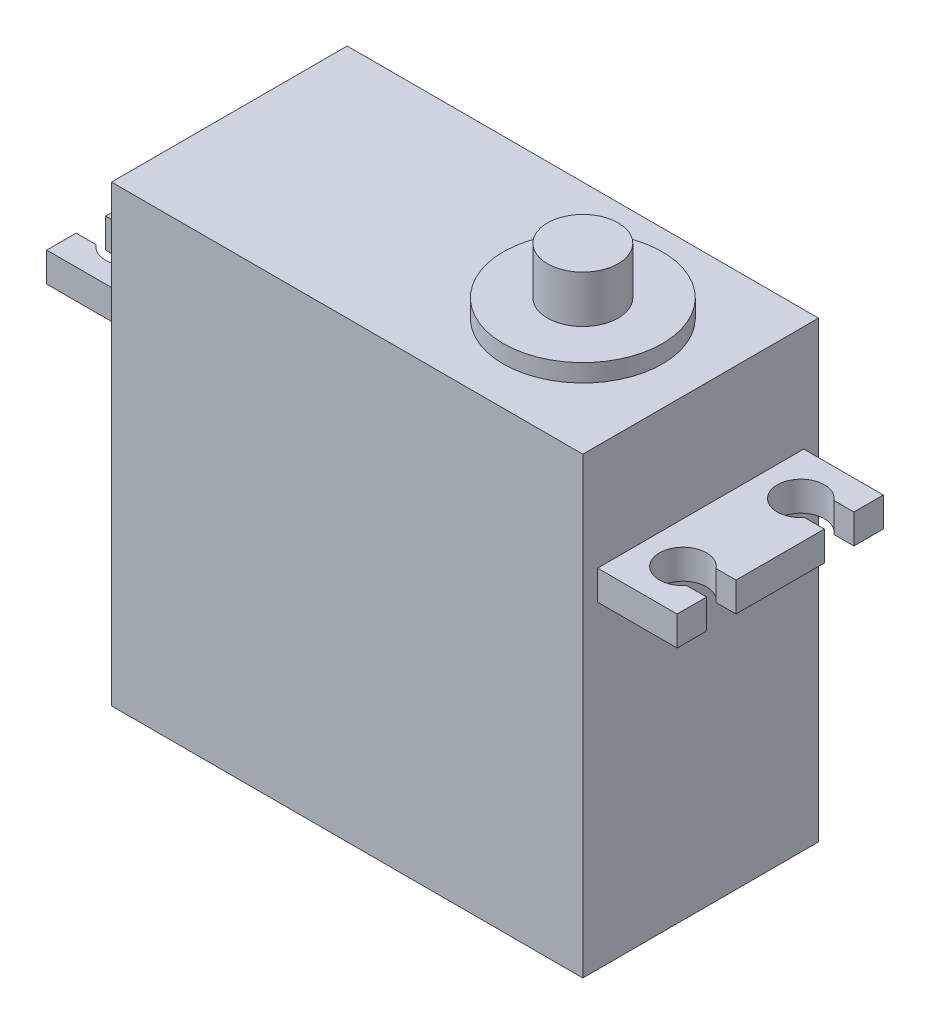
ISO-10303-21;
HEADER;
FILE_DESCRIPTION(('STEP AP214'),'2;1');
FILE_NAME('part.step','',(''),(''),'','','');
FILE_SCHEMA(('AUTOMOTIVE_DESIGN { 1 0 10303 214 1 1 1 1 }'));
ENDSEC;
DATA;
#1=APPLICATION_CONTEXT('core data for automotive mechanical design processes');
#2=APPLICATION_PROTOCOL_DEFINITION('international standard','automotive_design',2000,#1);
#3=PRODUCT_CONTEXT('',#1,'mechanical');
#4=PRODUCT('Part','Part','',(#3));
#5=PRODUCT_RELATED_PRODUCT_CATEGORY('part','',(#4));
#6=PRODUCT_DEFINITION_FORMATION('','',#4);
#7=PRODUCT_DEFINITION_CONTEXT('part definition',#1,'design');
#8=PRODUCT_DEFINITION('design','',#6,#7);
#9=PRODUCT_DEFINITION_SHAPE('','',#8);
#10=(LENGTH_UNIT() NAMED_UNIT(*) SI_UNIT(.MILLI.,.METRE.));
#11=(NAMED_UNIT(*) PLANE_ANGLE_UNIT() SI_UNIT($,.RADIAN.));
#12=(NAMED_UNIT(*) SI_UNIT($,.STERADIAN.) SOLID_ANGLE_UNIT());
#13=UNCERTAINTY_MEASURE_WITH_UNIT(LENGTH_MEASURE(1.E-05),#10,'distance_accuracy_value','');
#14=(GEOMETRIC_REPRESENTATION_CONTEXT(3) GLOBAL_UNCERTAINTY_ASSIGNED_CONTEXT((#13)) GLOBAL_UNIT_ASSIGNED_CONTEXT((#10,
#11,#12)) REPRESENTATION_CONTEXT('',''));
#15=CARTESIAN_POINT('',(0.,0.,0.));
#16=DIRECTION('',(0.,0.,1.));
#17=DIRECTION('',(1.,0.,0.));
#18=AXIS2_PLACEMENT_3D('',#15,#16,#17);
#19=CARTESIAN_POINT('',(0.,11.5,0.));
#20=DIRECTION('',(0.,1.,0.));
#21=DIRECTION('',(0.,0.,1.));
#22=AXIS2_PLACEMENT_3D('',#19,#20,#21);
#23=PLANE('',#22);
#24=DIRECTION('',(0.,0.,1.));
#25=VECTOR('',#24,1.);
#26=CARTESIAN_POINT('',(20.,11.5,0.));
#27=LINE('',#26,#25);
#28=CARTESIAN_POINT('',(20.,11.5,-10.));
#29=VERTEX_POINT('',#28);
#30=CARTESIAN_POINT('',(20.,11.5,10.));
#31=VERTEX_POINT('',#30);
#32=EDGE_CURVE('E190',#29,#31,#27,.T.);
#33=ORIENTED_EDGE('',*,*,#32,.F.);
#34=DIRECTION('',(1.,0.,0.));
#35=VECTOR('',#34,1.);
#36=CARTESIAN_POINT('',(0.,11.5,-10.));
#37=LINE('',#36,#35);
#38=CARTESIAN_POINT('',(-20.,11.5,-10.));
#39=VERTEX_POINT('',#38);
#40=EDGE_CURVE('E187',#39,#29,#37,.T.);
#41=ORIENTED_EDGE('',*,*,#40,.F.);
#42=DIRECTION('',(0.,0.,1.));
#43=VECTOR('',#42,1.);
#44=CARTESIAN_POINT('',(-20.,11.5,0.));
#45=LINE('',#44,#43);
#46=CARTESIAN_POINT('',(-20.,11.5,10.));
#47=VERTEX_POINT('',#46);
#48=EDGE_CURVE('E184',#39,#47,#45,.T.);
#49=ORIENTED_EDGE('',*,*,#48,.T.);
#50=DIRECTION('',(1.,0.,0.));
#51=VECTOR('',#50,1.);
#52=CARTESIAN_POINT('',(0.,11.5,10.));
#53=LINE('',#52,#51);
#54=EDGE_CURVE('E181',#47,#31,#53,.T.);
#55=ORIENTED_EDGE('',*,*,#54,.T.);
#56=EDGE_LOOP('',(#33,#41,#49,#55));
#57=FACE_BOUND('',#56,.T.);
#58=CARTESIAN_POINT('',(9.99999999999999,11.5,0.));
#59=DIRECTION('',(0.,1.,0.));
#60=DIRECTION('',(0.,0.,1.));
#61=AXIS2_PLACEMENT_3D('',#58,#59,#60);
#62=CIRCLE('',#61,6.75);
#63=CARTESIAN_POINT('',(9.99999999999999,11.5,6.75));
#64=VERTEX_POINT('',#63);
#65=EDGE_CURVE('E797',#64,#64,#62,.T.);
#66=ORIENTED_EDGE('',*,*,#65,.F.);
#67=EDGE_LOOP('',(#66));
#68=FACE_BOUND('',#67,.T.);
#69=ADVANCED_FACE('F33',(#57,#68),#23,.T.);
#70=CARTESIAN_POINT('',(0.,0.,0.));
#71=DIRECTION('',(0.,1.,0.));
#72=DIRECTION('',(0.,0.,1.));
#73=AXIS2_PLACEMENT_3D('',#70,#71,#72);
#74=PLANE('',#73);
#75=DIRECTION('',(0.,0.,1.));
#76=VECTOR('',#75,1.);
#77=CARTESIAN_POINT('',(20.,0.,0.));
#78=LINE('',#77,#76);
#79=CARTESIAN_POINT('',(20.,0.,-8.75));
#80=VERTEX_POINT('',#79);
#81=CARTESIAN_POINT('',(20.,0.,8.75));
#82=VERTEX_POINT('',#81);
#83=EDGE_CURVE('E11',#80,#82,#78,.T.);
#84=ORIENTED_EDGE('',*,*,#83,.F.);
#85=DIRECTION('',(1.,0.,0.));
#86=VECTOR('',#85,1.);
#87=CARTESIAN_POINT('',(0.,0.,-8.74999999999999));
#88=LINE('',#87,#86);
#89=CARTESIAN_POINT('',(26.75,0.,-8.75));
#90=VERTEX_POINT('',#89);
#91=EDGE_CURVE('E234',#80,#90,#88,.T.);
#92=ORIENTED_EDGE('',*,*,#91,.T.);
#93=DIRECTION('',(0.,0.,1.));
#94=VECTOR('',#93,1.);
#95=CARTESIAN_POINT('',(26.75,0.,0.));
#96=LINE('',#95,#94);
#97=CARTESIAN_POINT('',(26.75,0.,-6.24999999999999));
#98=VERTEX_POINT('',#97);
#99=EDGE_CURVE('E287',#90,#98,#96,.T.);
#100=ORIENTED_EDGE('',*,*,#99,.T.);
#101=DIRECTION('',(1.,0.,0.));
#102=VECTOR('',#101,1.);
#103=CARTESIAN_POINT('',(0.,0.,-6.24999999999999));
#104=LINE('',#103,#102);
#105=CARTESIAN_POINT('',(25.0612494995996,0.,-6.24999999999999));
#106=VERTEX_POINT('',#105);
#107=EDGE_CURVE('E293',#106,#98,#104,.T.);
#108=ORIENTED_EDGE('',*,*,#107,.F.);
#109=CARTESIAN_POINT('',(23.5,0.,-5.));
#110=DIRECTION('',(0.,1.,0.));
#111=DIRECTION('',(0.,0.,1.));
#112=AXIS2_PLACEMENT_3D('',#109,#110,#111);
#113=CIRCLE('',#112,2.);
#114=CARTESIAN_POINT('',(25.0612494995996,0.,-3.74999999999999));
#115=VERTEX_POINT('',#114);
#116=EDGE_CURVE('E290',#106,#115,#113,.T.);
#117=ORIENTED_EDGE('',*,*,#116,.T.);
#118=DIRECTION('',(1.,0.,0.));
#119=VECTOR('',#118,1.);
#120=CARTESIAN_POINT('',(0.,0.,-3.74999999999999));
#121=LINE('',#120,#119);
#122=CARTESIAN_POINT('',(26.75,0.,-3.74999999999999));
#123=VERTEX_POINT('',#122);
#124=EDGE_CURVE('E286',#115,#123,#121,.T.);
#125=ORIENTED_EDGE('',*,*,#124,.T.);
#126=CARTESIAN_POINT('',(26.75,0.,3.74999999999999));
#127=VERTEX_POINT('',#126);
#128=EDGE_CURVE('E283',#123,#127,#96,.T.);
#129=ORIENTED_EDGE('',*,*,#128,.T.);
#130=DIRECTION('',(1.,0.,0.));
#131=VECTOR('',#130,1.);
#132=CARTESIAN_POINT('',(0.,0.,3.74999999999999));
#133=LINE('',#132,#131);
#134=CARTESIAN_POINT('',(25.0612494995996,0.,3.74999999999999));
#135=VERTEX_POINT('',#134);
#136=EDGE_CURVE('E279',#135,#127,#133,.T.);
#137=ORIENTED_EDGE('',*,*,#136,.F.);
#138=CARTESIAN_POINT('',(23.5,0.,5.));
#139=DIRECTION('',(0.,1.,0.));
#140=DIRECTION('',(0.,0.,1.));
#141=AXIS2_PLACEMENT_3D('',#138,#139,#140);
#142=CIRCLE('',#141,2.);
#143=CARTESIAN_POINT('',(25.0612494995996,0.,6.24999999999999));
#144=VERTEX_POINT('',#143);
#145=EDGE_CURVE('E276',#135,#144,#142,.T.);
#146=ORIENTED_EDGE('',*,*,#145,.T.);
#147=DIRECTION('',(1.,0.,0.));
#148=VECTOR('',#147,1.);
#149=CARTESIAN_POINT('',(0.,0.,6.24999999999999));
#150=LINE('',#149,#148);
#151=CARTESIAN_POINT('',(26.75,0.,6.24999999999999));
#152=VERTEX_POINT('',#151);
#153=EDGE_CURVE('E246',#144,#152,#150,.T.);
#154=ORIENTED_EDGE('',*,*,#153,.T.);
#155=CARTESIAN_POINT('',(26.75,0.,8.75));
#156=VERTEX_POINT('',#155);
#157=EDGE_CURVE('E233',#152,#156,#96,.T.);
#158=ORIENTED_EDGE('',*,*,#157,.T.);
#159=DIRECTION('',(1.,0.,0.));
#160=VECTOR('',#159,1.);
#161=CARTESIAN_POINT('',(0.,0.,8.74999999999999));
#162=LINE('',#161,#160);
#163=EDGE_CURVE('E230',#82,#156,#162,.T.);
#164=ORIENTED_EDGE('',*,*,#163,.F.);
#165=EDGE_LOOP('',(#84,#92,#100,#108,#117,#125,#129,#137,#146,#154,#158,#164));
#166=FACE_BOUND('',#165,.T.);
#167=ADVANCED_FACE('F325',(#166),#74,.F.);
#168=CARTESIAN_POINT('',(-23.5,2.5,5.));
#169=DIRECTION('',(0.,-1.,0.));
#170=DIRECTION('',(0.,0.,-1.));
#171=AXIS2_PLACEMENT_3D('',#168,#169,#170);
#172=CYLINDRICAL_SURFACE('',#171,2.);
#173=CARTESIAN_POINT('',(-23.5,0.,5.));
#174=DIRECTION('',(0.,1.,0.));
#175=DIRECTION('',(0.,0.,1.));
#176=AXIS2_PLACEMENT_3D('',#173,#174,#175);
#177=CIRCLE('',#176,2.);
#178=CARTESIAN_POINT('',(-25.0612494995996,0.,6.25));
#179=VERTEX_POINT('',#178);
#180=CARTESIAN_POINT('',(-25.0612494995996,0.,3.75));
#181=VERTEX_POINT('',#180);
#182=EDGE_CURVE('E171',#179,#181,#177,.T.);
#183=ORIENTED_EDGE('',*,*,#182,.F.);
#184=DIRECTION('',(0.,-1.,0.));
#185=VECTOR('',#184,1.);
#186=CARTESIAN_POINT('',(-25.0612494995996,2.5,6.25));
#187=LINE('',#186,#185);
#188=CARTESIAN_POINT('',(-25.0612494995996,2.5,6.25));
#189=VERTEX_POINT('',#188);
#190=EDGE_CURVE('E94',#189,#179,#187,.T.);
#191=ORIENTED_EDGE('',*,*,#190,.F.);
#192=CARTESIAN_POINT('',(-23.5,2.5,5.));
#193=DIRECTION('',(0.,1.,0.));
#194=DIRECTION('',(0.,0.,1.));
#195=AXIS2_PLACEMENT_3D('',#192,#193,#194);
#196=CIRCLE('',#195,2.);
#197=CARTESIAN_POINT('',(-25.0612494995996,2.5,3.75));
#198=VERTEX_POINT('',#197);
#199=EDGE_CURVE('E163',#189,#198,#196,.T.);
#200=ORIENTED_EDGE('',*,*,#199,.T.);
#201=DIRECTION('',(0.,-1.,0.));
#202=VECTOR('',#201,1.);
#203=CARTESIAN_POINT('',(-25.0612494995996,2.5,3.75));
#204=LINE('',#203,#202);
#205=EDGE_CURVE('E51',#198,#181,#204,.T.);
#206=ORIENTED_EDGE('',*,*,#205,.T.);
#207=EDGE_LOOP('',(#183,#191,#200,#206));
#208=FACE_BOUND('',#207,.T.);
#209=ADVANCED_FACE('F35',(#208),#172,.F.);
#210=CARTESIAN_POINT('',(0.,2.5,6.25));
#211=DIRECTION('',(0.,0.,1.));
#212=DIRECTION('',(1.,0.,0.));
#213=AXIS2_PLACEMENT_3D('',#210,#211,#212);
#214=PLANE('',#213);
#215=DIRECTION('',(-1.,0.,0.));
#216=VECTOR('',#215,1.);
#217=CARTESIAN_POINT('',(0.,0.,6.25));
#218=LINE('',#217,#216);
#219=CARTESIAN_POINT('',(-26.75,0.,6.25));
#220=VERTEX_POINT('',#219);
#221=EDGE_CURVE('E366',#179,#220,#218,.T.);
#222=ORIENTED_EDGE('',*,*,#221,.T.);
#223=DIRECTION('',(0.,-1.,0.));
#224=VECTOR('',#223,1.);
#225=CARTESIAN_POINT('',(-26.75,2.5,6.25));
#226=LINE('',#225,#224);
#227=CARTESIAN_POINT('',(-26.75,2.5,6.25));
#228=VERTEX_POINT('',#227);
#229=EDGE_CURVE('E357',#228,#220,#226,.T.);
#230=ORIENTED_EDGE('',*,*,#229,.F.);
#231=DIRECTION('',(-1.,0.,0.));
#232=VECTOR('',#231,1.);
#233=CARTESIAN_POINT('',(0.,2.5,6.25));
#234=LINE('',#233,#232);
#235=EDGE_CURVE('E157',#189,#228,#234,.T.);
#236=ORIENTED_EDGE('',*,*,#235,.F.);
#237=ORIENTED_EDGE('',*,*,#190,.T.);
#238=EDGE_LOOP('',(#222,#230,#236,#237));
#239=FACE_BOUND('',#238,.T.);
#240=ADVANCED_FACE('F753',(#239),#214,.F.);
#241=CARTESIAN_POINT('',(-26.75,2.5,0.));
#242=DIRECTION('',(1.,0.,0.));
#243=DIRECTION('',(0.,0.,-1.));
#244=AXIS2_PLACEMENT_3D('',#241,#242,#243);
#245=PLANE('',#244);
#246=DIRECTION('',(0.,0.,1.));
#247=VECTOR('',#246,1.);
#248=CARTESIAN_POINT('',(-26.75,0.,0.));
#249=LINE('',#248,#247);
#250=CARTESIAN_POINT('',(-26.75,0.,8.75));
#251=VERTEX_POINT('',#250);
#252=EDGE_CURVE('E361',#220,#251,#249,.T.);
#253=ORIENTED_EDGE('',*,*,#252,.T.);
#254=DIRECTION('',(0.,-1.,0.));
#255=VECTOR('',#254,1.);
#256=CARTESIAN_POINT('',(-26.75,2.5,8.75));
#257=LINE('',#256,#255);
#258=CARTESIAN_POINT('',(-26.75,2.5,8.75));
#259=VERTEX_POINT('',#258);
#260=EDGE_CURVE('E349',#259,#251,#257,.T.);
#261=ORIENTED_EDGE('',*,*,#260,.F.);
#262=DIRECTION('',(0.,0.,1.));
#263=VECTOR('',#262,1.);
#264=CARTESIAN_POINT('',(-26.75,2.5,0.));
#265=LINE('',#264,#263);
#266=EDGE_CURVE('E150',#228,#259,#265,.T.);
#267=ORIENTED_EDGE('',*,*,#266,.F.);
#268=ORIENTED_EDGE('',*,*,#229,.T.);
#269=EDGE_LOOP('',(#253,#261,#267,#268));
#270=FACE_BOUND('',#269,.T.);
#271=ADVANCED_FACE('F430',(#270),#245,.F.);
#272=CARTESIAN_POINT('',(0.,2.5,8.74999999999999));
#273=DIRECTION('',(0.,0.,1.));
#274=DIRECTION('',(1.,0.,0.));
#275=AXIS2_PLACEMENT_3D('',#272,#273,#274);
#276=PLANE('',#275);
#277=DIRECTION('',(-1.,0.,0.));
#278=VECTOR('',#277,1.);
#279=CARTESIAN_POINT('',(0.,0.,8.74999999999999));
#280=LINE('',#279,#278);
#281=CARTESIAN_POINT('',(-20.,0.,8.75));
#282=VERTEX_POINT('',#281);
#283=EDGE_CURVE('E338',#282,#251,#280,.T.);
#284=ORIENTED_EDGE('',*,*,#283,.F.);
#285=DIRECTION('',(0.,-1.,0.));
#286=VECTOR('',#285,1.);
#287=CARTESIAN_POINT('',(-20.,2.5,8.75));
#288=LINE('',#287,#286);
#289=CARTESIAN_POINT('',(-20.,2.5,8.75));
#290=VERTEX_POINT('',#289);
#291=EDGE_CURVE('E344',#290,#282,#288,.T.);
#292=ORIENTED_EDGE('',*,*,#291,.F.);
#293=DIRECTION('',(-1.,0.,0.));
#294=VECTOR('',#293,1.);
#295=CARTESIAN_POINT('',(0.,2.5,8.74999999999999));
#296=LINE('',#295,#294);
#297=EDGE_CURVE('E156',#290,#259,#296,.T.);
#298=ORIENTED_EDGE('',*,*,#297,.T.);
#299=ORIENTED_EDGE('',*,*,#260,.T.);
#300=EDGE_LOOP('',(#284,#292,#298,#299));
#301=FACE_BOUND('',#300,.T.);
#302=ADVANCED_FACE('F414',(#301),#276,.T.);
#303=CARTESIAN_POINT('',(0.,2.5,-8.74999999999999));
#304=DIRECTION('',(0.,0.,1.));
#305=DIRECTION('',(1.,0.,0.));
#306=AXIS2_PLACEMENT_3D('',#303,#304,#305);
#307=PLANE('',#306);
#308=DIRECTION('',(-1.,0.,0.));
#309=VECTOR('',#308,1.);
#310=CARTESIAN_POINT('',(0.,0.,-8.74999999999999));
#311=LINE('',#310,#309);
#312=CARTESIAN_POINT('',(-20.,0.,-8.75));
#313=VERTEX_POINT('',#312);
#314=CARTESIAN_POINT('',(-26.75,0.,-8.75));
#315=VERTEX_POINT('',#314);
#316=EDGE_CURVE('E335',#313,#315,#311,.T.);
#317=ORIENTED_EDGE('',*,*,#316,.T.);
#318=DIRECTION('',(0.,-1.,0.));
#319=VECTOR('',#318,1.);
#320=CARTESIAN_POINT('',(-26.75,2.5,-8.75));
#321=LINE('',#320,#319);
#322=CARTESIAN_POINT('',(-26.75,2.5,-8.75));
#323=VERTEX_POINT('',#322);
#324=EDGE_CURVE('E345',#323,#315,#321,.T.);
#325=ORIENTED_EDGE('',*,*,#324,.F.);
#326=DIRECTION('',(-1.,0.,0.));
#327=VECTOR('',#326,1.);
#328=CARTESIAN_POINT('',(0.,2.5,-8.74999999999999));
#329=LINE('',#328,#327);
#330=CARTESIAN_POINT('',(-20.,2.5,-8.75));
#331=VERTEX_POINT('',#330);
#332=EDGE_CURVE('E155',#331,#323,#329,.T.);
#333=ORIENTED_EDGE('',*,*,#332,.F.);
#334=DIRECTION('',(0.,-1.,0.));
#335=VECTOR('',#334,1.);
#336=CARTESIAN_POINT('',(-20.,2.5,-8.75));
#337=LINE('',#336,#335);
#338=EDGE_CURVE('E341',#331,#313,#337,.T.);
#339=ORIENTED_EDGE('',*,*,#338,.T.);
#340=EDGE_LOOP('',(#317,#325,#333,#339));
#341=FACE_BOUND('',#340,.T.);
#342=ADVANCED_FACE('F404',(#341),#307,.F.);
#343=CARTESIAN_POINT('',(-26.75,0.,-6.24999999999999));
#344=VERTEX_POINT('',#343);
#345=EDGE_CURVE('E337',#315,#344,#249,.T.);
#346=ORIENTED_EDGE('',*,*,#345,.T.);
#347=DIRECTION('',(0.,-1.,0.));
#348=VECTOR('',#347,1.);
#349=CARTESIAN_POINT('',(-26.75,2.5,-6.24999999999999));
#350=LINE('',#349,#348);
#351=CARTESIAN_POINT('',(-26.75,2.5,-6.24999999999999));
#352=VERTEX_POINT('',#351);
#353=EDGE_CURVE('E391',#352,#344,#350,.T.);
#354=ORIENTED_EDGE('',*,*,#353,.F.);
#355=EDGE_CURVE('E149',#323,#352,#265,.T.);
#356=ORIENTED_EDGE('',*,*,#355,.F.);
#357=ORIENTED_EDGE('',*,*,#324,.T.);
#358=EDGE_LOOP('',(#346,#354,#356,#357));
#359=FACE_BOUND('',#358,.T.);
#360=ADVANCED_FACE('F396',(#359),#245,.F.);
#361=CARTESIAN_POINT('',(0.,2.5,-6.25));
#362=DIRECTION('',(0.,0.,1.));
#363=DIRECTION('',(1.,0.,0.));
#364=AXIS2_PLACEMENT_3D('',#361,#362,#363);
#365=PLANE('',#364);
#366=DIRECTION('',(-1.,0.,0.));
#367=VECTOR('',#366,1.);
#368=CARTESIAN_POINT('',(0.,0.,-6.25));
#369=LINE('',#368,#367);
#370=CARTESIAN_POINT('',(-25.0612494995996,0.,-6.24999999999999));
#371=VERTEX_POINT('',#370);
#372=EDGE_CURVE('E373',#371,#344,#369,.T.);
#373=ORIENTED_EDGE('',*,*,#372,.F.);
#374=DIRECTION('',(0.,-1.,0.));
#375=VECTOR('',#374,1.);
#376=CARTESIAN_POINT('',(-25.0612494995996,2.5,-6.24999999999999));
#377=LINE('',#376,#375);
#378=CARTESIAN_POINT('',(-25.0612494995996,2.5,-6.24999999999999));
#379=VERTEX_POINT('',#378);
#380=EDGE_CURVE('E390',#379,#371,#377,.T.);
#381=ORIENTED_EDGE('',*,*,#380,.F.);
#382=DIRECTION('',(-1.,0.,0.));
#383=VECTOR('',#382,1.);
#384=CARTESIAN_POINT('',(0.,2.5,-6.25));
#385=LINE('',#384,#383);
#386=EDGE_CURVE('E154',#379,#352,#385,.T.);
#387=ORIENTED_EDGE('',*,*,#386,.T.);
#388=ORIENTED_EDGE('',*,*,#353,.T.);
#389=EDGE_LOOP('',(#373,#381,#387,#388));
#390=FACE_BOUND('',#389,.T.);
#391=ADVANCED_FACE('F735',(#390),#365,.T.);
#392=CARTESIAN_POINT('',(-23.5,2.5,-5.));
#393=DIRECTION('',(0.,-1.,0.));
#394=DIRECTION('',(0.,0.,-1.));
#395=AXIS2_PLACEMENT_3D('',#392,#393,#394);
#396=CYLINDRICAL_SURFACE('',#395,2.);
#397=CARTESIAN_POINT('',(-23.5,0.,-5.));
#398=DIRECTION('',(0.,1.,0.));
#399=DIRECTION('',(0.,0.,1.));
#400=AXIS2_PLACEMENT_3D('',#397,#398,#399);
#401=CIRCLE('',#400,2.);
#402=CARTESIAN_POINT('',(-25.0612494995996,0.,-3.74999999999999));
#403=VERTEX_POINT('',#402);
#404=EDGE_CURVE('E379',#403,#371,#401,.T.);
#405=ORIENTED_EDGE('',*,*,#404,.F.);
#406=DIRECTION('',(0.,-1.,0.));
#407=VECTOR('',#406,1.);
#408=CARTESIAN_POINT('',(-25.0612494995996,2.5,-3.74999999999999));
#409=LINE('',#408,#407);
#410=CARTESIAN_POINT('',(-25.0612494995996,2.5,-3.74999999999999));
#411=VERTEX_POINT('',#410);
#412=EDGE_CURVE('E144',#411,#403,#409,.T.);
#413=ORIENTED_EDGE('',*,*,#412,.F.);
#414=CARTESIAN_POINT('',(-23.5,2.5,-5.));
#415=DIRECTION('',(0.,1.,0.));
#416=DIRECTION('',(0.,0.,1.));
#417=AXIS2_PLACEMENT_3D('',#414,#415,#416);
#418=CIRCLE('',#417,2.);
#419=EDGE_CURVE('E134',#411,#379,#418,.T.);
#420=ORIENTED_EDGE('',*,*,#419,.T.);
#421=ORIENTED_EDGE('',*,*,#380,.T.);
#422=EDGE_LOOP('',(#405,#413,#420,#421));
#423=FACE_BOUND('',#422,.T.);
#424=ADVANCED_FACE('F727',(#423),#396,.F.);
#425=CARTESIAN_POINT('',(0.,2.5,-3.74999999999999));
#426=DIRECTION('',(0.,0.,1.));
#427=DIRECTION('',(1.,0.,0.));
#428=AXIS2_PLACEMENT_3D('',#425,#426,#427);
#429=PLANE('',#428);
#430=DIRECTION('',(-1.,0.,0.));
#431=VECTOR('',#430,1.);
#432=CARTESIAN_POINT('',(0.,0.,-3.74999999999999));
#433=LINE('',#432,#431);
#434=CARTESIAN_POINT('',(-26.75,0.,-3.74999999999999));
#435=VERTEX_POINT('',#434);
#436=EDGE_CURVE('E141',#403,#435,#433,.T.);
#437=ORIENTED_EDGE('',*,*,#436,.T.);
#438=DIRECTION('',(0.,-1.,0.));
#439=VECTOR('',#438,1.);
#440=CARTESIAN_POINT('',(-26.75,2.5,-3.74999999999999));
#441=LINE('',#440,#439);
#442=CARTESIAN_POINT('',(-26.75,2.5,-3.74999999999999));
#443=VERTEX_POINT('',#442);
#444=EDGE_CURVE('E138',#443,#435,#441,.T.);
#445=ORIENTED_EDGE('',*,*,#444,.F.);
#446=DIRECTION('',(-1.,0.,0.));
#447=VECTOR('',#446,1.);
#448=CARTESIAN_POINT('',(0.,2.5,-3.74999999999999));
#449=LINE('',#448,#447);
#450=EDGE_CURVE('E125',#411,#443,#449,.T.);
#451=ORIENTED_EDGE('',*,*,#450,.F.);
#452=ORIENTED_EDGE('',*,*,#412,.T.);
#453=EDGE_LOOP('',(#437,#445,#451,#452));
#454=FACE_BOUND('',#453,.T.);
#455=ADVANCED_FACE('F139',(#454),#429,.F.);
#456=CARTESIAN_POINT('',(-26.75,0.,3.75));
#457=VERTEX_POINT('',#456);
#458=EDGE_CURVE('E368',#435,#457,#249,.T.);
#459=ORIENTED_EDGE('',*,*,#458,.T.);
#460=DIRECTION('',(0.,-1.,0.));
#461=VECTOR('',#460,1.);
#462=CARTESIAN_POINT('',(-26.75,2.5,3.75));
#463=LINE('',#462,#461);
#464=CARTESIAN_POINT('',(-26.75,2.5,3.75));
#465=VERTEX_POINT('',#464);
#466=EDGE_CURVE('E85',#465,#457,#463,.T.);
#467=ORIENTED_EDGE('',*,*,#466,.F.);
#468=EDGE_CURVE('E131',#443,#465,#265,.T.);
#469=ORIENTED_EDGE('',*,*,#468,.F.);
#470=ORIENTED_EDGE('',*,*,#444,.T.);
#471=EDGE_LOOP('',(#459,#467,#469,#470));
#472=FACE_BOUND('',#471,.T.);
#473=ADVANCED_FACE('F146',(#472),#245,.F.);
#474=CARTESIAN_POINT('',(0.,2.5,3.74999999999999));
#475=DIRECTION('',(0.,0.,1.));
#476=DIRECTION('',(1.,0.,0.));
#477=AXIS2_PLACEMENT_3D('',#474,#475,#476);
#478=PLANE('',#477);
#479=DIRECTION('',(-1.,0.,0.));
#480=VECTOR('',#479,1.);
#481=CARTESIAN_POINT('',(0.,0.,3.74999999999999));
#482=LINE('',#481,#480);
#483=EDGE_CURVE('E165',#181,#457,#482,.T.);
#484=ORIENTED_EDGE('',*,*,#483,.F.);
#485=ORIENTED_EDGE('',*,*,#205,.F.);
#486=DIRECTION('',(-1.,0.,0.));
#487=VECTOR('',#486,1.);
#488=CARTESIAN_POINT('',(0.,2.5,3.74999999999999));
#489=LINE('',#488,#487);
#490=EDGE_CURVE('E147',#198,#465,#489,.T.);
#491=ORIENTED_EDGE('',*,*,#490,.T.);
#492=ORIENTED_EDGE('',*,*,#466,.T.);
#493=EDGE_LOOP('',(#484,#485,#491,#492));
#494=FACE_BOUND('',#493,.T.);
#495=ADVANCED_FACE('F421',(#494),#478,.T.);
#496=CARTESIAN_POINT('',(0.,2.5,0.));
#497=DIRECTION('',(0.,1.,0.));
#498=DIRECTION('',(0.,0.,1.));
#499=AXIS2_PLACEMENT_3D('',#496,#497,#498);
#500=PLANE('',#499);
#501=ORIENTED_EDGE('',*,*,#199,.F.);
#502=ORIENTED_EDGE('',*,*,#235,.T.);
#503=ORIENTED_EDGE('',*,*,#266,.T.);
#504=ORIENTED_EDGE('',*,*,#297,.F.);
#505=DIRECTION('',(0.,0.,1.));
#506=VECTOR('',#505,1.);
#507=CARTESIAN_POINT('',(-20.,2.5,0.));
#508=LINE('',#507,#506);
#509=EDGE_CURVE('E162',#331,#290,#508,.T.);
#510=ORIENTED_EDGE('',*,*,#509,.F.);
#511=ORIENTED_EDGE('',*,*,#332,.T.);
#512=ORIENTED_EDGE('',*,*,#355,.T.);
#513=ORIENTED_EDGE('',*,*,#386,.F.);
#514=ORIENTED_EDGE('',*,*,#419,.F.);
#515=ORIENTED_EDGE('',*,*,#450,.T.);
#516=ORIENTED_EDGE('',*,*,#468,.T.);
#517=ORIENTED_EDGE('',*,*,#490,.F.);
#518=EDGE_LOOP('',(#501,#502,#503,#504,#510,#511,#512,#513,#514,#515,#516,#517));
#519=FACE_BOUND('',#518,.T.);
#520=ADVANCED_FACE('F128',(#519),#500,.T.);
#521=ORIENTED_EDGE('',*,*,#316,.F.);
#522=DIRECTION('',(0.,0.,1.));
#523=VECTOR('',#522,1.);
#524=CARTESIAN_POINT('',(-20.,0.,0.));
#525=LINE('',#524,#523);
#526=EDGE_CURVE('E43',#313,#282,#525,.T.);
#527=ORIENTED_EDGE('',*,*,#526,.T.);
#528=ORIENTED_EDGE('',*,*,#283,.T.);
#529=ORIENTED_EDGE('',*,*,#252,.F.);
#530=ORIENTED_EDGE('',*,*,#221,.F.);
#531=ORIENTED_EDGE('',*,*,#182,.T.);
#532=ORIENTED_EDGE('',*,*,#483,.T.);
#533=ORIENTED_EDGE('',*,*,#458,.F.);
#534=ORIENTED_EDGE('',*,*,#436,.F.);
#535=ORIENTED_EDGE('',*,*,#404,.T.);
#536=ORIENTED_EDGE('',*,*,#372,.T.);
#537=ORIENTED_EDGE('',*,*,#345,.F.);
#538=EDGE_LOOP('',(#521,#527,#528,#529,#530,#531,#532,#533,#534,#535,#536,#537));
#539=FACE_BOUND('',#538,.T.);
#540=ADVANCED_FACE('F399',(#539),#74,.F.);
#541=CARTESIAN_POINT('',(20.,11.5,0.));
#542=DIRECTION('',(1.,0.,0.));
#543=DIRECTION('',(0.,0.,-1.));
#544=AXIS2_PLACEMENT_3D('',#541,#542,#543);
#545=PLANE('',#544);
#546=DIRECTION('',(0.,-1.,0.));
#547=VECTOR('',#546,1.);
#548=CARTESIAN_POINT('',(20.,2.5,-8.75));
#549=LINE('',#548,#547);
#550=CARTESIAN_POINT('',(20.,2.5,-8.75));
#551=VERTEX_POINT('',#550);
#552=EDGE_CURVE('E214',#551,#80,#549,.T.);
#553=ORIENTED_EDGE('',*,*,#552,.T.);
#554=ORIENTED_EDGE('',*,*,#83,.T.);
#555=DIRECTION('',(0.,-1.,0.));
#556=VECTOR('',#555,1.);
#557=CARTESIAN_POINT('',(20.,2.5,8.75));
#558=LINE('',#557,#556);
#559=CARTESIAN_POINT('',(20.,2.5,8.75));
#560=VERTEX_POINT('',#559);
#561=EDGE_CURVE('E223',#560,#82,#558,.T.);
#562=ORIENTED_EDGE('',*,*,#561,.F.);
#563=DIRECTION('',(0.,0.,1.));
#564=VECTOR('',#563,1.);
#565=CARTESIAN_POINT('',(20.,2.5,0.));
#566=LINE('',#565,#564);
#567=EDGE_CURVE('E266',#551,#560,#566,.T.);
#568=ORIENTED_EDGE('',*,*,#567,.F.);
#569=EDGE_LOOP('',(#553,#554,#562,#568));
#570=FACE_BOUND('',#569,.T.);
#571=DIRECTION('',(0.,0.,1.));
#572=VECTOR('',#571,1.);
#573=CARTESIAN_POINT('',(20.,-27.,0.));
#574=LINE('',#573,#572);
#575=CARTESIAN_POINT('',(20.,-27.,-10.));
#576=VERTEX_POINT('',#575);
#577=CARTESIAN_POINT('',(20.,-27.,10.));
#578=VERTEX_POINT('',#577);
#579=EDGE_CURVE('E790',#576,#578,#574,.T.);
#580=ORIENTED_EDGE('',*,*,#579,.F.);
#581=DIRECTION('',(0.,-1.,0.));
#582=VECTOR('',#581,1.);
#583=CARTESIAN_POINT('',(20.,11.5,-10.));
#584=LINE('',#583,#582);
#585=EDGE_CURVE('E168',#29,#576,#584,.T.);
#586=ORIENTED_EDGE('',*,*,#585,.F.);
#587=ORIENTED_EDGE('',*,*,#32,.T.);
#588=DIRECTION('',(0.,-1.,0.));
#589=VECTOR('',#588,1.);
#590=CARTESIAN_POINT('',(20.,11.5,10.));
#591=LINE('',#590,#589);
#592=EDGE_CURVE('E178',#31,#578,#591,.T.);
#593=ORIENTED_EDGE('',*,*,#592,.T.);
#594=EDGE_LOOP('',(#580,#586,#587,#593));
#595=FACE_BOUND('',#594,.T.);
#596=ADVANCED_FACE('F455',(#570,#595),#545,.T.);
#597=CARTESIAN_POINT('',(0.,11.5,-10.));
#598=DIRECTION('',(0.,0.,-1.));
#599=DIRECTION('',(-1.,0.,0.));
#600=AXIS2_PLACEMENT_3D('',#597,#598,#599);
#601=PLANE('',#600);
#602=ORIENTED_EDGE('',*,*,#585,.T.);
#603=DIRECTION('',(1.,0.,0.));
#604=VECTOR('',#603,1.);
#605=CARTESIAN_POINT('',(0.,-27.,-10.));
#606=LINE('',#605,#604);
#607=CARTESIAN_POINT('',(-20.,-27.,-10.));
#608=VERTEX_POINT('',#607);
#609=EDGE_CURVE('E794',#608,#576,#606,.T.);
#610=ORIENTED_EDGE('',*,*,#609,.F.);
#611=DIRECTION('',(0.,-1.,0.));
#612=VECTOR('',#611,1.);
#613=CARTESIAN_POINT('',(-20.,11.5,-10.));
#614=LINE('',#613,#612);
#615=EDGE_CURVE('E172',#39,#608,#614,.T.);
#616=ORIENTED_EDGE('',*,*,#615,.F.);
#617=ORIENTED_EDGE('',*,*,#40,.T.);
#618=EDGE_LOOP('',(#602,#610,#616,#617));
#619=FACE_BOUND('',#618,.T.);
#620=ADVANCED_FACE('F452',(#619),#601,.T.);
#621=CARTESIAN_POINT('',(-20.,11.5,0.));
#622=DIRECTION('',(1.,0.,0.));
#623=DIRECTION('',(0.,0.,-1.));
#624=AXIS2_PLACEMENT_3D('',#621,#622,#623);
#625=PLANE('',#624);
#626=ORIENTED_EDGE('',*,*,#526,.F.);
#627=ORIENTED_EDGE('',*,*,#338,.F.);
#628=ORIENTED_EDGE('',*,*,#509,.T.);
#629=ORIENTED_EDGE('',*,*,#291,.T.);
#630=EDGE_LOOP('',(#626,#627,#628,#629));
#631=FACE_BOUND('',#630,.T.);
#632=ORIENTED_EDGE('',*,*,#615,.T.);
#633=DIRECTION('',(0.,0.,1.));
#634=VECTOR('',#633,1.);
#635=CARTESIAN_POINT('',(-20.,-27.,0.));
#636=LINE('',#635,#634);
#637=CARTESIAN_POINT('',(-20.,-27.,10.));
#638=VERTEX_POINT('',#637);
#639=EDGE_CURVE('E803',#608,#638,#636,.T.);
#640=ORIENTED_EDGE('',*,*,#639,.T.);
#641=DIRECTION('',(0.,-1.,0.));
#642=VECTOR('',#641,1.);
#643=CARTESIAN_POINT('',(-20.,11.5,10.));
#644=LINE('',#643,#642);
#645=EDGE_CURVE('E175',#47,#638,#644,.T.);
#646=ORIENTED_EDGE('',*,*,#645,.F.);
#647=ORIENTED_EDGE('',*,*,#48,.F.);
#648=EDGE_LOOP('',(#632,#640,#646,#647));
#649=FACE_BOUND('',#648,.T.);
#650=ADVANCED_FACE('F409',(#631,#649),#625,.F.);
#651=CARTESIAN_POINT('',(0.,11.5,10.));
#652=DIRECTION('',(0.,0.,-1.));
#653=DIRECTION('',(-1.,0.,0.));
#654=AXIS2_PLACEMENT_3D('',#651,#652,#653);
#655=PLANE('',#654);
#656=ORIENTED_EDGE('',*,*,#645,.T.);
#657=DIRECTION('',(1.,0.,0.));
#658=VECTOR('',#657,1.);
#659=CARTESIAN_POINT('',(0.,-27.,10.));
#660=LINE('',#659,#658);
#661=EDGE_CURVE('E280',#638,#578,#660,.T.);
#662=ORIENTED_EDGE('',*,*,#661,.T.);
#663=ORIENTED_EDGE('',*,*,#592,.F.);
#664=ORIENTED_EDGE('',*,*,#54,.F.);
#665=EDGE_LOOP('',(#656,#662,#663,#664));
#666=FACE_BOUND('',#665,.T.);
#667=ADVANCED_FACE('F446',(#666),#655,.F.);
#668=CARTESIAN_POINT('',(23.5,2.5,5.));
#669=DIRECTION('',(0.,-1.,0.));
#670=DIRECTION('',(0.,0.,-1.));
#671=AXIS2_PLACEMENT_3D('',#668,#669,#670);
#672=CYLINDRICAL_SURFACE('',#671,2.);
#673=ORIENTED_EDGE('',*,*,#145,.F.);
#674=DIRECTION('',(0.,-1.,0.));
#675=VECTOR('',#674,1.);
#676=CARTESIAN_POINT('',(25.0612494995996,2.5,3.74999999999999));
#677=LINE('',#676,#675);
#678=CARTESIAN_POINT('',(25.0612494995996,2.5,3.74999999999999));
#679=VERTEX_POINT('',#678);
#680=EDGE_CURVE('E193',#679,#135,#677,.T.);
#681=ORIENTED_EDGE('',*,*,#680,.F.);
#682=CARTESIAN_POINT('',(23.5,2.5,5.));
#683=DIRECTION('',(0.,1.,0.));
#684=DIRECTION('',(0.,0.,1.));
#685=AXIS2_PLACEMENT_3D('',#682,#683,#684);
#686=CIRCLE('',#685,2.);
#687=CARTESIAN_POINT('',(25.0612494995996,2.5,6.24999999999999));
#688=VERTEX_POINT('',#687);
#689=EDGE_CURVE('E242',#679,#688,#686,.T.);
#690=ORIENTED_EDGE('',*,*,#689,.T.);
#691=DIRECTION('',(0.,-1.,0.));
#692=VECTOR('',#691,1.);
#693=CARTESIAN_POINT('',(25.0612494995996,2.5,6.24999999999999));
#694=LINE('',#693,#692);
#695=EDGE_CURVE('E275',#688,#144,#694,.T.);
#696=ORIENTED_EDGE('',*,*,#695,.T.);
#697=EDGE_LOOP('',(#673,#681,#690,#696));
#698=FACE_BOUND('',#697,.T.);
#699=ADVANCED_FACE('F444',(#698),#672,.F.);
#700=CARTESIAN_POINT('',(0.,2.5,3.74999999999999));
#701=DIRECTION('',(0.,0.,-1.));
#702=DIRECTION('',(-1.,0.,0.));
#703=AXIS2_PLACEMENT_3D('',#700,#701,#702);
#704=PLANE('',#703);
#705=ORIENTED_EDGE('',*,*,#136,.T.);
#706=DIRECTION('',(0.,-1.,0.));
#707=VECTOR('',#706,1.);
#708=CARTESIAN_POINT('',(26.75,2.5,3.74999999999999));
#709=LINE('',#708,#707);
#710=CARTESIAN_POINT('',(26.75,2.5,3.74999999999999));
#711=VERTEX_POINT('',#710);
#712=EDGE_CURVE('E196',#711,#127,#709,.T.);
#713=ORIENTED_EDGE('',*,*,#712,.F.);
#714=DIRECTION('',(1.,0.,0.));
#715=VECTOR('',#714,1.);
#716=CARTESIAN_POINT('',(0.,2.5,3.74999999999999));
#717=LINE('',#716,#715);
#718=EDGE_CURVE('E245',#679,#711,#717,.T.);
#719=ORIENTED_EDGE('',*,*,#718,.F.);
#720=ORIENTED_EDGE('',*,*,#680,.T.);
#721=EDGE_LOOP('',(#705,#713,#719,#720));
#722=FACE_BOUND('',#721,.T.);
#723=ADVANCED_FACE('F486',(#722),#704,.F.);
#724=CARTESIAN_POINT('',(26.75,2.5,0.));
#725=DIRECTION('',(1.,0.,0.));
#726=DIRECTION('',(0.,0.,-1.));
#727=AXIS2_PLACEMENT_3D('',#724,#725,#726);
#728=PLANE('',#727);
#729=ORIENTED_EDGE('',*,*,#128,.F.);
#730=DIRECTION('',(0.,-1.,0.));
#731=VECTOR('',#730,1.);
#732=CARTESIAN_POINT('',(26.75,2.5,-3.74999999999999));
#733=LINE('',#732,#731);
#734=CARTESIAN_POINT('',(26.75,2.5,-3.74999999999999));
#735=VERTEX_POINT('',#734);
#736=EDGE_CURVE('E199',#735,#123,#733,.T.);
#737=ORIENTED_EDGE('',*,*,#736,.F.);
#738=DIRECTION('',(0.,0.,1.));
#739=VECTOR('',#738,1.);
#740=CARTESIAN_POINT('',(26.75,2.5,0.));
#741=LINE('',#740,#739);
#742=EDGE_CURVE('E249',#735,#711,#741,.T.);
#743=ORIENTED_EDGE('',*,*,#742,.T.);
#744=ORIENTED_EDGE('',*,*,#712,.T.);
#745=EDGE_LOOP('',(#729,#737,#743,#744));
#746=FACE_BOUND('',#745,.T.);
#747=ADVANCED_FACE('F493',(#746),#728,.T.);
#748=CARTESIAN_POINT('',(0.,2.5,-3.74999999999999));
#749=DIRECTION('',(0.,0.,-1.));
#750=DIRECTION('',(-1.,0.,0.));
#751=AXIS2_PLACEMENT_3D('',#748,#749,#750);
#752=PLANE('',#751);
#753=ORIENTED_EDGE('',*,*,#124,.F.);
#754=DIRECTION('',(0.,-1.,0.));
#755=VECTOR('',#754,1.);
#756=CARTESIAN_POINT('',(25.0612494995996,2.5,-3.74999999999999));
#757=LINE('',#756,#755);
#758=CARTESIAN_POINT('',(25.0612494995996,2.5,-3.74999999999999));
#759=VERTEX_POINT('',#758);
#760=EDGE_CURVE('E202',#759,#115,#757,.T.);
#761=ORIENTED_EDGE('',*,*,#760,.F.);
#762=DIRECTION('',(1.,0.,0.));
#763=VECTOR('',#762,1.);
#764=CARTESIAN_POINT('',(0.,2.5,-3.74999999999999));
#765=LINE('',#764,#763);
#766=EDGE_CURVE('E252',#759,#735,#765,.T.);
#767=ORIENTED_EDGE('',*,*,#766,.T.);
#768=ORIENTED_EDGE('',*,*,#736,.T.);
#769=EDGE_LOOP('',(#753,#761,#767,#768));
#770=FACE_BOUND('',#769,.T.);
#771=ADVANCED_FACE('F500',(#770),#752,.T.);
#772=CARTESIAN_POINT('',(23.5,2.5,-5.));
#773=DIRECTION('',(0.,-1.,0.));
#774=DIRECTION('',(0.,0.,-1.));
#775=AXIS2_PLACEMENT_3D('',#772,#773,#774);
#776=CYLINDRICAL_SURFACE('',#775,2.);
#777=ORIENTED_EDGE('',*,*,#116,.F.);
#778=DIRECTION('',(0.,-1.,0.));
#779=VECTOR('',#778,1.);
#780=CARTESIAN_POINT('',(25.0612494995996,2.5,-6.24999999999999));
#781=LINE('',#780,#779);
#782=CARTESIAN_POINT('',(25.0612494995996,2.5,-6.24999999999999));
#783=VERTEX_POINT('',#782);
#784=EDGE_CURVE('E205',#783,#106,#781,.T.);
#785=ORIENTED_EDGE('',*,*,#784,.F.);
#786=CARTESIAN_POINT('',(23.5,2.5,-5.));
#787=DIRECTION('',(0.,1.,0.));
#788=DIRECTION('',(0.,0.,1.));
#789=AXIS2_PLACEMENT_3D('',#786,#787,#788);
#790=CIRCLE('',#789,2.);
#791=EDGE_CURVE('E257',#783,#759,#790,.T.);
#792=ORIENTED_EDGE('',*,*,#791,.T.);
#793=ORIENTED_EDGE('',*,*,#760,.T.);
#794=EDGE_LOOP('',(#777,#785,#792,#793));
#795=FACE_BOUND('',#794,.T.);
#796=ADVANCED_FACE('F509',(#795),#776,.F.);
#797=CARTESIAN_POINT('',(0.,2.5,-6.24999999999999));
#798=DIRECTION('',(0.,0.,-1.));
#799=DIRECTION('',(-1.,0.,0.));
#800=AXIS2_PLACEMENT_3D('',#797,#798,#799);
#801=PLANE('',#800);
#802=ORIENTED_EDGE('',*,*,#107,.T.);
#803=DIRECTION('',(0.,-1.,0.));
#804=VECTOR('',#803,1.);
#805=CARTESIAN_POINT('',(26.75,2.5,-6.24999999999999));
#806=LINE('',#805,#804);
#807=CARTESIAN_POINT('',(26.75,2.5,-6.24999999999999));
#808=VERTEX_POINT('',#807);
#809=EDGE_CURVE('E208',#808,#98,#806,.T.);
#810=ORIENTED_EDGE('',*,*,#809,.F.);
#811=DIRECTION('',(1.,0.,0.));
#812=VECTOR('',#811,1.);
#813=CARTESIAN_POINT('',(0.,2.5,-6.24999999999999));
#814=LINE('',#813,#812);
#815=EDGE_CURVE('E260',#783,#808,#814,.T.);
#816=ORIENTED_EDGE('',*,*,#815,.F.);
#817=ORIENTED_EDGE('',*,*,#784,.T.);
#818=EDGE_LOOP('',(#802,#810,#816,#817));
#819=FACE_BOUND('',#818,.T.);
#820=ADVANCED_FACE('F517',(#819),#801,.F.);
#821=ORIENTED_EDGE('',*,*,#99,.F.);
#822=DIRECTION('',(0.,-1.,0.));
#823=VECTOR('',#822,1.);
#824=CARTESIAN_POINT('',(26.75,2.5,-8.75));
#825=LINE('',#824,#823);
#826=CARTESIAN_POINT('',(26.75,2.5,-8.75));
#827=VERTEX_POINT('',#826);
#828=EDGE_CURVE('E211',#827,#90,#825,.T.);
#829=ORIENTED_EDGE('',*,*,#828,.F.);
#830=EDGE_CURVE('E254',#827,#808,#741,.T.);
#831=ORIENTED_EDGE('',*,*,#830,.T.);
#832=ORIENTED_EDGE('',*,*,#809,.T.);
#833=EDGE_LOOP('',(#821,#829,#831,#832));
#834=FACE_BOUND('',#833,.T.);
#835=ADVANCED_FACE('F503',(#834),#728,.T.);
#836=CARTESIAN_POINT('',(0.,2.5,-8.74999999999999));
#837=DIRECTION('',(0.,0.,-1.));
#838=DIRECTION('',(-1.,0.,0.));
#839=AXIS2_PLACEMENT_3D('',#836,#837,#838);
#840=PLANE('',#839);
#841=ORIENTED_EDGE('',*,*,#91,.F.);
#842=ORIENTED_EDGE('',*,*,#552,.F.);
#843=DIRECTION('',(1.,0.,0.));
#844=VECTOR('',#843,1.);
#845=CARTESIAN_POINT('',(0.,2.5,-8.74999999999999));
#846=LINE('',#845,#844);
#847=EDGE_CURVE('E263',#551,#827,#846,.T.);
#848=ORIENTED_EDGE('',*,*,#847,.T.);
#849=ORIENTED_EDGE('',*,*,#828,.T.);
#850=EDGE_LOOP('',(#841,#842,#848,#849));
#851=FACE_BOUND('',#850,.T.);
#852=ADVANCED_FACE('F532',(#851),#840,.T.);
#853=CARTESIAN_POINT('',(0.,2.5,8.74999999999999));
#854=DIRECTION('',(0.,0.,-1.));
#855=DIRECTION('',(-1.,0.,0.));
#856=AXIS2_PLACEMENT_3D('',#853,#854,#855);
#857=PLANE('',#856);
#858=ORIENTED_EDGE('',*,*,#163,.T.);
#859=DIRECTION('',(0.,-1.,0.));
#860=VECTOR('',#859,1.);
#861=CARTESIAN_POINT('',(26.75,2.5,8.75));
#862=LINE('',#861,#860);
#863=CARTESIAN_POINT('',(26.75,2.5,8.75));
#864=VERTEX_POINT('',#863);
#865=EDGE_CURVE('E217',#864,#156,#862,.T.);
#866=ORIENTED_EDGE('',*,*,#865,.F.);
#867=DIRECTION('',(1.,0.,0.));
#868=VECTOR('',#867,1.);
#869=CARTESIAN_POINT('',(0.,2.5,8.74999999999999));
#870=LINE('',#869,#868);
#871=EDGE_CURVE('E269',#560,#864,#870,.T.);
#872=ORIENTED_EDGE('',*,*,#871,.F.);
#873=ORIENTED_EDGE('',*,*,#561,.T.);
#874=EDGE_LOOP('',(#858,#866,#872,#873));
#875=FACE_BOUND('',#874,.T.);
#876=ADVANCED_FACE('F320',(#875),#857,.F.);
#877=ORIENTED_EDGE('',*,*,#157,.F.);
#878=DIRECTION('',(0.,-1.,0.));
#879=VECTOR('',#878,1.);
#880=CARTESIAN_POINT('',(26.75,2.5,6.24999999999999));
#881=LINE('',#880,#879);
#882=CARTESIAN_POINT('',(26.75,2.5,6.24999999999999));
#883=VERTEX_POINT('',#882);
#884=EDGE_CURVE('E299',#883,#152,#881,.T.);
#885=ORIENTED_EDGE('',*,*,#884,.F.);
#886=EDGE_CURVE('E253',#883,#864,#741,.T.);
#887=ORIENTED_EDGE('',*,*,#886,.T.);
#888=ORIENTED_EDGE('',*,*,#865,.T.);
#889=EDGE_LOOP('',(#877,#885,#887,#888));
#890=FACE_BOUND('',#889,.T.);
#891=ADVANCED_FACE('F311',(#890),#728,.T.);
#892=CARTESIAN_POINT('',(0.,2.5,6.24999999999999));
#893=DIRECTION('',(0.,0.,-1.));
#894=DIRECTION('',(-1.,0.,0.));
#895=AXIS2_PLACEMENT_3D('',#892,#893,#894);
#896=PLANE('',#895);
#897=ORIENTED_EDGE('',*,*,#153,.F.);
#898=ORIENTED_EDGE('',*,*,#695,.F.);
#899=DIRECTION('',(1.,0.,0.));
#900=VECTOR('',#899,1.);
#901=CARTESIAN_POINT('',(0.,2.5,6.24999999999999));
#902=LINE('',#901,#900);
#903=EDGE_CURVE('E272',#688,#883,#902,.T.);
#904=ORIENTED_EDGE('',*,*,#903,.T.);
#905=ORIENTED_EDGE('',*,*,#884,.T.);
#906=EDGE_LOOP('',(#897,#898,#904,#905));
#907=FACE_BOUND('',#906,.T.);
#908=ADVANCED_FACE('F552',(#907),#896,.T.);
#909=CARTESIAN_POINT('',(0.,2.5,0.));
#910=DIRECTION('',(0.,1.,0.));
#911=DIRECTION('',(0.,0.,1.));
#912=AXIS2_PLACEMENT_3D('',#909,#910,#911);
#913=PLANE('',#912);
#914=ORIENTED_EDGE('',*,*,#689,.F.);
#915=ORIENTED_EDGE('',*,*,#718,.T.);
#916=ORIENTED_EDGE('',*,*,#742,.F.);
#917=ORIENTED_EDGE('',*,*,#766,.F.);
#918=ORIENTED_EDGE('',*,*,#791,.F.);
#919=ORIENTED_EDGE('',*,*,#815,.T.);
#920=ORIENTED_EDGE('',*,*,#830,.F.);
#921=ORIENTED_EDGE('',*,*,#847,.F.);
#922=ORIENTED_EDGE('',*,*,#567,.T.);
#923=ORIENTED_EDGE('',*,*,#871,.T.);
#924=ORIENTED_EDGE('',*,*,#886,.F.);
#925=ORIENTED_EDGE('',*,*,#903,.F.);
#926=EDGE_LOOP('',(#914,#915,#916,#917,#918,#919,#920,#921,#922,#923,#924,#925));
#927=FACE_BOUND('',#926,.T.);
#928=ADVANCED_FACE('F558',(#927),#913,.T.);
#929=CARTESIAN_POINT('',(0.,-27.,0.));
#930=DIRECTION('',(0.,1.,0.));
#931=DIRECTION('',(0.,0.,1.));
#932=AXIS2_PLACEMENT_3D('',#929,#930,#931);
#933=PLANE('',#932);
#934=ORIENTED_EDGE('',*,*,#579,.T.);
#935=ORIENTED_EDGE('',*,*,#661,.F.);
#936=ORIENTED_EDGE('',*,*,#639,.F.);
#937=ORIENTED_EDGE('',*,*,#609,.T.);
#938=EDGE_LOOP('',(#934,#935,#936,#937));
#939=FACE_BOUND('',#938,.T.);
#940=ADVANCED_FACE('F565',(#939),#933,.F.);
#941=CARTESIAN_POINT('',(9.99999999999999,13.,0.));
#942=DIRECTION('',(0.,1.,0.));
#943=DIRECTION('',(0.,0.,1.));
#944=AXIS2_PLACEMENT_3D('',#941,#942,#943);
#945=PLANE('',#944);
#946=CARTESIAN_POINT('',(9.99999999999999,13.,0.));
#947=DIRECTION('',(0.,1.,0.));
#948=DIRECTION('',(0.,0.,1.));
#949=AXIS2_PLACEMENT_3D('',#946,#947,#948);
#950=CIRCLE('',#949,6.75);
#951=CARTESIAN_POINT('',(9.99999999999999,13.,6.75));
#952=VERTEX_POINT('',#951);
#953=EDGE_CURVE('E791',#952,#952,#950,.T.);
#954=ORIENTED_EDGE('',*,*,#953,.T.);
#955=EDGE_LOOP('',(#954));
#956=FACE_BOUND('',#955,.T.);
#957=CARTESIAN_POINT('',(9.99999999999999,13.,0.));
#958=DIRECTION('',(0.,1.,0.));
#959=DIRECTION('',(0.,0.,1.));
#960=AXIS2_PLACEMENT_3D('',#957,#958,#959);
#961=CIRCLE('',#960,3.);
#962=CARTESIAN_POINT('',(9.99999999999999,13.,3.));
#963=VERTEX_POINT('',#962);
#964=EDGE_CURVE('E786',#963,#963,#961,.T.);
#965=ORIENTED_EDGE('',*,*,#964,.F.);
#966=EDGE_LOOP('',(#965));
#967=FACE_BOUND('',#966,.T.);
#968=ADVANCED_FACE('F573',(#956,#967),#945,.T.);
#969=CARTESIAN_POINT('',(9.99999999999999,13.,0.));
#970=DIRECTION('',(0.,-1.,0.));
#971=DIRECTION('',(0.,0.,-1.));
#972=AXIS2_PLACEMENT_3D('',#969,#970,#971);
#973=CYLINDRICAL_SURFACE('',#972,6.75);
#974=ORIENTED_EDGE('',*,*,#953,.F.);
#975=EDGE_LOOP('',(#974));
#976=FACE_BOUND('',#975,.T.);
#977=ORIENTED_EDGE('',*,*,#65,.T.);
#978=EDGE_LOOP('',(#977));
#979=FACE_BOUND('',#978,.T.);
#980=ADVANCED_FACE('F586',(#976,#979),#973,.T.);
#981=CARTESIAN_POINT('',(0.,17.,0.));
#982=DIRECTION('',(0.,1.,0.));
#983=DIRECTION('',(0.,0.,1.));
#984=AXIS2_PLACEMENT_3D('',#981,#982,#983);
#985=PLANE('',#984);
#986=CARTESIAN_POINT('',(9.99999999999999,17.,0.));
#987=DIRECTION('',(0.,1.,0.));
#988=DIRECTION('',(0.,0.,1.));
#989=AXIS2_PLACEMENT_3D('',#986,#987,#988);
#990=CIRCLE('',#989,3.);
#991=CARTESIAN_POINT('',(9.99999999999999,17.,3.));
#992=VERTEX_POINT('',#991);
#993=EDGE_CURVE('E789',#992,#992,#990,.T.);
#994=ORIENTED_EDGE('',*,*,#993,.T.);
#995=EDGE_LOOP('',(#994));
#996=FACE_BOUND('',#995,.T.);
#997=ADVANCED_FACE('F593',(#996),#985,.T.);
#998=CARTESIAN_POINT('',(9.99999999999999,17.,0.));
#999=DIRECTION('',(0.,-1.,0.));
#1000=DIRECTION('',(0.,0.,-1.));
#1001=AXIS2_PLACEMENT_3D('',#998,#999,#1000);
#1002=CYLINDRICAL_SURFACE('',#1001,3.);
#1003=ORIENTED_EDGE('',*,*,#964,.T.);
#1004=EDGE_LOOP('',(#1003));
#1005=FACE_BOUND('',#1004,.T.);
#1006=ORIENTED_EDGE('',*,*,#993,.F.);
#1007=EDGE_LOOP('',(#1006));
#1008=FACE_BOUND('',#1007,.T.);
#1009=ADVANCED_FACE('F601',(#1005,#1008),#1002,.T.);
#1010=CLOSED_SHELL('',(#69,#167,#209,#240,#271,#302,#342,#360,#391,#424,#455,#473,#495,#520,
#540,#596,#620,#650,#667,#699,#723,#747,#771,#796,#820,#835,#852,#876,#891,#908,#928,#940,#968,
#980,#997,#1009));
#1011=MANIFOLD_SOLID_BREP('B2',#1010);
#1012=ADVANCED_BREP_SHAPE_REPRESENTATION('',(#18,#1011),#14);
#1013=SHAPE_DEFINITION_REPRESENTATION(#9,#1012);
ENDSEC;
END-ISO-10303-21;
